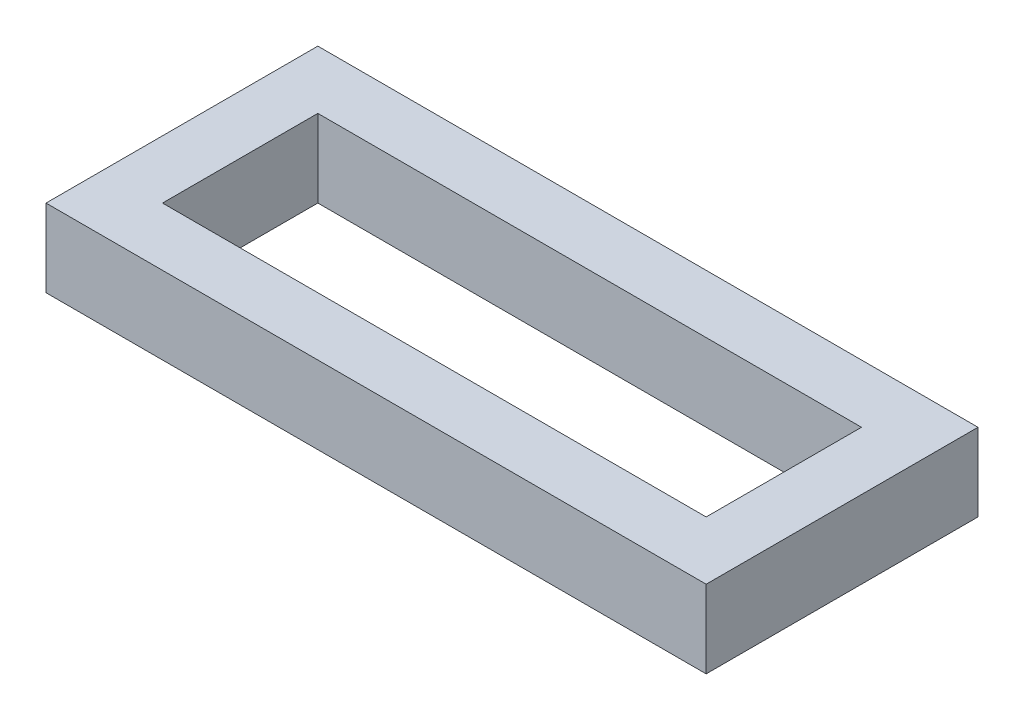
ISO-10303-21;
HEADER;
FILE_DESCRIPTION(('STEP AP214'),'2;1');
FILE_NAME('part.step','',(''),(''),'','','');
FILE_SCHEMA(('AUTOMOTIVE_DESIGN { 1 0 10303 214 1 1 1 1 }'));
ENDSEC;
DATA;
#1=APPLICATION_CONTEXT('core data for automotive mechanical design processes');
#2=APPLICATION_PROTOCOL_DEFINITION('international standard','automotive_design',2000,#1);
#3=PRODUCT_CONTEXT('',#1,'mechanical');
#4=PRODUCT('Part','Part','',(#3));
#5=PRODUCT_RELATED_PRODUCT_CATEGORY('part','',(#4));
#6=PRODUCT_DEFINITION_FORMATION('','',#4);
#7=PRODUCT_DEFINITION_CONTEXT('part definition',#1,'design');
#8=PRODUCT_DEFINITION('design','',#6,#7);
#9=PRODUCT_DEFINITION_SHAPE('','',#8);
#10=(LENGTH_UNIT() NAMED_UNIT(*) SI_UNIT(.MILLI.,.METRE.));
#11=(NAMED_UNIT(*) PLANE_ANGLE_UNIT() SI_UNIT($,.RADIAN.));
#12=(NAMED_UNIT(*) SI_UNIT($,.STERADIAN.) SOLID_ANGLE_UNIT());
#13=UNCERTAINTY_MEASURE_WITH_UNIT(LENGTH_MEASURE(1.E-05),#10,'distance_accuracy_value','');
#14=(GEOMETRIC_REPRESENTATION_CONTEXT(3) GLOBAL_UNCERTAINTY_ASSIGNED_CONTEXT((#13)) GLOBAL_UNIT_ASSIGNED_CONTEXT((#10,
#11,#12)) REPRESENTATION_CONTEXT('',''));
#15=CARTESIAN_POINT('',(0.,0.,0.));
#16=DIRECTION('',(0.,0.,1.));
#17=DIRECTION('',(1.,0.,0.));
#18=AXIS2_PLACEMENT_3D('',#15,#16,#17);
#19=CARTESIAN_POINT('',(0.,20.,0.));
#20=DIRECTION('',(0.,1.,0.));
#21=DIRECTION('',(0.,0.,1.));
#22=AXIS2_PLACEMENT_3D('',#19,#20,#21);
#23=PLANE('',#22);
#24=DIRECTION('',(0.,0.,-1.));
#25=VECTOR('',#24,1.);
#26=CARTESIAN_POINT('',(85.,20.,-35.));
#27=LINE('',#26,#25);
#28=CARTESIAN_POINT('',(85.,20.,35.));
#29=VERTEX_POINT('',#28);
#30=CARTESIAN_POINT('',(85.,20.,-35.));
#31=VERTEX_POINT('',#30);
#32=EDGE_CURVE('E153',#29,#31,#27,.T.);
#33=ORIENTED_EDGE('',*,*,#32,.T.);
#34=DIRECTION('',(-1.,0.,0.));
#35=VECTOR('',#34,1.);
#36=CARTESIAN_POINT('',(-85.,20.,-35.));
#37=LINE('',#36,#35);
#38=CARTESIAN_POINT('',(-85.,20.,-35.));
#39=VERTEX_POINT('',#38);
#40=EDGE_CURVE('E157',#31,#39,#37,.T.);
#41=ORIENTED_EDGE('',*,*,#40,.T.);
#42=DIRECTION('',(0.,0.,1.));
#43=VECTOR('',#42,1.);
#44=CARTESIAN_POINT('',(-85.,20.,-35.));
#45=LINE('',#44,#43);
#46=CARTESIAN_POINT('',(-85.,20.,35.));
#47=VERTEX_POINT('',#46);
#48=EDGE_CURVE('E161',#39,#47,#45,.T.);
#49=ORIENTED_EDGE('',*,*,#48,.T.);
#50=DIRECTION('',(1.,0.,0.));
#51=VECTOR('',#50,1.);
#52=CARTESIAN_POINT('',(-85.,20.,35.));
#53=LINE('',#52,#51);
#54=EDGE_CURVE('E164',#47,#29,#53,.T.);
#55=ORIENTED_EDGE('',*,*,#54,.T.);
#56=EDGE_LOOP('',(#33,#41,#49,#55));
#57=FACE_BOUND('',#56,.T.);
#58=DIRECTION('',(-1.,0.,0.));
#59=VECTOR('',#58,1.);
#60=CARTESIAN_POINT('',(-70.,20.,-20.));
#61=LINE('',#60,#59);
#62=CARTESIAN_POINT('',(70.,20.,-20.));
#63=VERTEX_POINT('',#62);
#64=CARTESIAN_POINT('',(-70.,20.,-20.));
#65=VERTEX_POINT('',#64);
#66=EDGE_CURVE('E114',#63,#65,#61,.T.);
#67=ORIENTED_EDGE('',*,*,#66,.F.);
#68=DIRECTION('',(0.,0.,-1.));
#69=VECTOR('',#68,1.);
#70=CARTESIAN_POINT('',(70.,20.,-20.));
#71=LINE('',#70,#69);
#72=CARTESIAN_POINT('',(70.,20.,20.));
#73=VERTEX_POINT('',#72);
#74=EDGE_CURVE('E105',#73,#63,#71,.T.);
#75=ORIENTED_EDGE('',*,*,#74,.F.);
#76=DIRECTION('',(1.,0.,0.));
#77=VECTOR('',#76,1.);
#78=CARTESIAN_POINT('',(-70.,20.,20.));
#79=LINE('',#78,#77);
#80=CARTESIAN_POINT('',(-70.,20.,20.));
#81=VERTEX_POINT('',#80);
#82=EDGE_CURVE('E131',#81,#73,#79,.T.);
#83=ORIENTED_EDGE('',*,*,#82,.F.);
#84=DIRECTION('',(0.,0.,1.));
#85=VECTOR('',#84,1.);
#86=CARTESIAN_POINT('',(-70.,20.,-20.));
#87=LINE('',#86,#85);
#88=EDGE_CURVE('E127',#65,#81,#87,.T.);
#89=ORIENTED_EDGE('',*,*,#88,.F.);
#90=EDGE_LOOP('',(#67,#75,#83,#89));
#91=FACE_BOUND('',#90,.T.);
#92=ADVANCED_FACE('F39',(#57,#91),#23,.T.);
#93=CARTESIAN_POINT('',(0.,0.,0.));
#94=DIRECTION('',(0.,1.,0.));
#95=DIRECTION('',(0.,0.,1.));
#96=AXIS2_PLACEMENT_3D('',#93,#94,#95);
#97=PLANE('',#96);
#98=DIRECTION('',(0.,0.,-1.));
#99=VECTOR('',#98,1.);
#100=CARTESIAN_POINT('',(85.,0.,-35.));
#101=LINE('',#100,#99);
#102=CARTESIAN_POINT('',(85.,0.,35.));
#103=VERTEX_POINT('',#102);
#104=CARTESIAN_POINT('',(85.,0.,-35.));
#105=VERTEX_POINT('',#104);
#106=EDGE_CURVE('E123',#103,#105,#101,.T.);
#107=ORIENTED_EDGE('',*,*,#106,.F.);
#108=DIRECTION('',(1.,0.,0.));
#109=VECTOR('',#108,1.);
#110=CARTESIAN_POINT('',(-85.,0.,35.));
#111=LINE('',#110,#109);
#112=CARTESIAN_POINT('',(-85.,0.,35.));
#113=VERTEX_POINT('',#112);
#114=EDGE_CURVE('E158',#113,#103,#111,.T.);
#115=ORIENTED_EDGE('',*,*,#114,.F.);
#116=DIRECTION('',(0.,0.,1.));
#117=VECTOR('',#116,1.);
#118=CARTESIAN_POINT('',(-85.,0.,-35.));
#119=LINE('',#118,#117);
#120=CARTESIAN_POINT('',(-85.,0.,-35.));
#121=VERTEX_POINT('',#120);
#122=EDGE_CURVE('E174',#121,#113,#119,.T.);
#123=ORIENTED_EDGE('',*,*,#122,.F.);
#124=DIRECTION('',(-1.,0.,0.));
#125=VECTOR('',#124,1.);
#126=CARTESIAN_POINT('',(-85.,0.,-35.));
#127=LINE('',#126,#125);
#128=EDGE_CURVE('E171',#105,#121,#127,.T.);
#129=ORIENTED_EDGE('',*,*,#128,.F.);
#130=EDGE_LOOP('',(#107,#115,#123,#129));
#131=FACE_BOUND('',#130,.T.);
#132=DIRECTION('',(0.,0.,-1.));
#133=VECTOR('',#132,1.);
#134=CARTESIAN_POINT('',(70.,0.,-20.));
#135=LINE('',#134,#133);
#136=CARTESIAN_POINT('',(70.,0.,20.));
#137=VERTEX_POINT('',#136);
#138=CARTESIAN_POINT('',(70.,0.,-20.));
#139=VERTEX_POINT('',#138);
#140=EDGE_CURVE('E63',#137,#139,#135,.T.);
#141=ORIENTED_EDGE('',*,*,#140,.T.);
#142=DIRECTION('',(-1.,0.,0.));
#143=VECTOR('',#142,1.);
#144=CARTESIAN_POINT('',(-70.,0.,-20.));
#145=LINE('',#144,#143);
#146=CARTESIAN_POINT('',(-70.,0.,-20.));
#147=VERTEX_POINT('',#146);
#148=EDGE_CURVE('E121',#139,#147,#145,.T.);
#149=ORIENTED_EDGE('',*,*,#148,.T.);
#150=DIRECTION('',(0.,0.,1.));
#151=VECTOR('',#150,1.);
#152=CARTESIAN_POINT('',(-70.,0.,-20.));
#153=LINE('',#152,#151);
#154=CARTESIAN_POINT('',(-70.,0.,20.));
#155=VERTEX_POINT('',#154);
#156=EDGE_CURVE('E140',#147,#155,#153,.T.);
#157=ORIENTED_EDGE('',*,*,#156,.T.);
#158=DIRECTION('',(1.,0.,0.));
#159=VECTOR('',#158,1.);
#160=CARTESIAN_POINT('',(-70.,0.,20.));
#161=LINE('',#160,#159);
#162=EDGE_CURVE('E115',#155,#137,#161,.T.);
#163=ORIENTED_EDGE('',*,*,#162,.T.);
#164=EDGE_LOOP('',(#141,#149,#157,#163));
#165=FACE_BOUND('',#164,.T.);
#166=ADVANCED_FACE('F197',(#131,#165),#97,.F.);
#167=CARTESIAN_POINT('',(85.,20.,-35.));
#168=DIRECTION('',(-1.,0.,0.));
#169=DIRECTION('',(0.,0.,1.));
#170=AXIS2_PLACEMENT_3D('',#167,#168,#169);
#171=PLANE('',#170);
#172=ORIENTED_EDGE('',*,*,#106,.T.);
#173=DIRECTION('',(0.,-1.,0.));
#174=VECTOR('',#173,1.);
#175=CARTESIAN_POINT('',(85.,20.,-35.));
#176=LINE('',#175,#174);
#177=EDGE_CURVE('E11',#31,#105,#176,.T.);
#178=ORIENTED_EDGE('',*,*,#177,.F.);
#179=ORIENTED_EDGE('',*,*,#32,.F.);
#180=DIRECTION('',(0.,-1.,0.));
#181=VECTOR('',#180,1.);
#182=CARTESIAN_POINT('',(85.,20.,35.));
#183=LINE('',#182,#181);
#184=EDGE_CURVE('E167',#29,#103,#183,.T.);
#185=ORIENTED_EDGE('',*,*,#184,.T.);
#186=EDGE_LOOP('',(#172,#178,#179,#185));
#187=FACE_BOUND('',#186,.T.);
#188=ADVANCED_FACE('F41',(#187),#171,.F.);
#189=CARTESIAN_POINT('',(-85.,20.,-35.));
#190=DIRECTION('',(0.,0.,1.));
#191=DIRECTION('',(1.,0.,0.));
#192=AXIS2_PLACEMENT_3D('',#189,#190,#191);
#193=PLANE('',#192);
#194=ORIENTED_EDGE('',*,*,#128,.T.);
#195=DIRECTION('',(0.,-1.,0.));
#196=VECTOR('',#195,1.);
#197=CARTESIAN_POINT('',(-85.,20.,-35.));
#198=LINE('',#197,#196);
#199=EDGE_CURVE('E48',#39,#121,#198,.T.);
#200=ORIENTED_EDGE('',*,*,#199,.F.);
#201=ORIENTED_EDGE('',*,*,#40,.F.);
#202=ORIENTED_EDGE('',*,*,#177,.T.);
#203=EDGE_LOOP('',(#194,#200,#201,#202));
#204=FACE_BOUND('',#203,.T.);
#205=ADVANCED_FACE('F207',(#204),#193,.F.);
#206=CARTESIAN_POINT('',(-85.,20.,-35.));
#207=DIRECTION('',(1.,0.,0.));
#208=DIRECTION('',(0.,0.,-1.));
#209=AXIS2_PLACEMENT_3D('',#206,#207,#208);
#210=PLANE('',#209);
#211=ORIENTED_EDGE('',*,*,#122,.T.);
#212=DIRECTION('',(0.,-1.,0.));
#213=VECTOR('',#212,1.);
#214=CARTESIAN_POINT('',(-85.,20.,35.));
#215=LINE('',#214,#213);
#216=EDGE_CURVE('E182',#47,#113,#215,.T.);
#217=ORIENTED_EDGE('',*,*,#216,.F.);
#218=ORIENTED_EDGE('',*,*,#48,.F.);
#219=ORIENTED_EDGE('',*,*,#199,.T.);
#220=EDGE_LOOP('',(#211,#217,#218,#219));
#221=FACE_BOUND('',#220,.T.);
#222=ADVANCED_FACE('F191',(#221),#210,.F.);
#223=CARTESIAN_POINT('',(-85.,20.,35.));
#224=DIRECTION('',(0.,0.,-1.));
#225=DIRECTION('',(-1.,0.,0.));
#226=AXIS2_PLACEMENT_3D('',#223,#224,#225);
#227=PLANE('',#226);
#228=ORIENTED_EDGE('',*,*,#114,.T.);
#229=ORIENTED_EDGE('',*,*,#184,.F.);
#230=ORIENTED_EDGE('',*,*,#54,.F.);
#231=ORIENTED_EDGE('',*,*,#216,.T.);
#232=EDGE_LOOP('',(#228,#229,#230,#231));
#233=FACE_BOUND('',#232,.T.);
#234=ADVANCED_FACE('F201',(#233),#227,.F.);
#235=CARTESIAN_POINT('',(70.,20.,-20.));
#236=DIRECTION('',(-1.,0.,0.));
#237=DIRECTION('',(0.,0.,1.));
#238=AXIS2_PLACEMENT_3D('',#235,#236,#237);
#239=PLANE('',#238);
#240=ORIENTED_EDGE('',*,*,#140,.F.);
#241=DIRECTION('',(0.,-1.,0.));
#242=VECTOR('',#241,1.);
#243=CARTESIAN_POINT('',(70.,20.,20.));
#244=LINE('',#243,#242);
#245=EDGE_CURVE('E109',#73,#137,#244,.T.);
#246=ORIENTED_EDGE('',*,*,#245,.F.);
#247=ORIENTED_EDGE('',*,*,#74,.T.);
#248=DIRECTION('',(0.,-1.,0.));
#249=VECTOR('',#248,1.);
#250=CARTESIAN_POINT('',(70.,20.,-20.));
#251=LINE('',#250,#249);
#252=EDGE_CURVE('E108',#63,#139,#251,.T.);
#253=ORIENTED_EDGE('',*,*,#252,.T.);
#254=EDGE_LOOP('',(#240,#246,#247,#253));
#255=FACE_BOUND('',#254,.T.);
#256=ADVANCED_FACE('F107',(#255),#239,.T.);
#257=CARTESIAN_POINT('',(-70.,20.,-20.));
#258=DIRECTION('',(0.,0.,1.));
#259=DIRECTION('',(1.,0.,0.));
#260=AXIS2_PLACEMENT_3D('',#257,#258,#259);
#261=PLANE('',#260);
#262=ORIENTED_EDGE('',*,*,#148,.F.);
#263=ORIENTED_EDGE('',*,*,#252,.F.);
#264=ORIENTED_EDGE('',*,*,#66,.T.);
#265=DIRECTION('',(0.,-1.,0.));
#266=VECTOR('',#265,1.);
#267=CARTESIAN_POINT('',(-70.,20.,-20.));
#268=LINE('',#267,#266);
#269=EDGE_CURVE('E124',#65,#147,#268,.T.);
#270=ORIENTED_EDGE('',*,*,#269,.T.);
#271=EDGE_LOOP('',(#262,#263,#264,#270));
#272=FACE_BOUND('',#271,.T.);
#273=ADVANCED_FACE('F118',(#272),#261,.T.);
#274=CARTESIAN_POINT('',(-70.,20.,-20.));
#275=DIRECTION('',(1.,0.,0.));
#276=DIRECTION('',(0.,0.,-1.));
#277=AXIS2_PLACEMENT_3D('',#274,#275,#276);
#278=PLANE('',#277);
#279=ORIENTED_EDGE('',*,*,#156,.F.);
#280=ORIENTED_EDGE('',*,*,#269,.F.);
#281=ORIENTED_EDGE('',*,*,#88,.T.);
#282=DIRECTION('',(0.,-1.,0.));
#283=VECTOR('',#282,1.);
#284=CARTESIAN_POINT('',(-70.,20.,20.));
#285=LINE('',#284,#283);
#286=EDGE_CURVE('E55',#81,#155,#285,.T.);
#287=ORIENTED_EDGE('',*,*,#286,.T.);
#288=EDGE_LOOP('',(#279,#280,#281,#287));
#289=FACE_BOUND('',#288,.T.);
#290=ADVANCED_FACE('F230',(#289),#278,.T.);
#291=CARTESIAN_POINT('',(-70.,20.,20.));
#292=DIRECTION('',(0.,0.,-1.));
#293=DIRECTION('',(-1.,0.,0.));
#294=AXIS2_PLACEMENT_3D('',#291,#292,#293);
#295=PLANE('',#294);
#296=ORIENTED_EDGE('',*,*,#162,.F.);
#297=ORIENTED_EDGE('',*,*,#286,.F.);
#298=ORIENTED_EDGE('',*,*,#82,.T.);
#299=ORIENTED_EDGE('',*,*,#245,.T.);
#300=EDGE_LOOP('',(#296,#297,#298,#299));
#301=FACE_BOUND('',#300,.T.);
#302=ADVANCED_FACE('F234',(#301),#295,.T.);
#303=CLOSED_SHELL('',(#92,#166,#188,#205,#222,#234,#256,#273,#290,#302));
#304=MANIFOLD_SOLID_BREP('B2',#303);
#305=ADVANCED_BREP_SHAPE_REPRESENTATION('',(#18,#304),#14);
#306=SHAPE_DEFINITION_REPRESENTATION(#9,#305);
ENDSEC;
END-ISO-10303-21;
